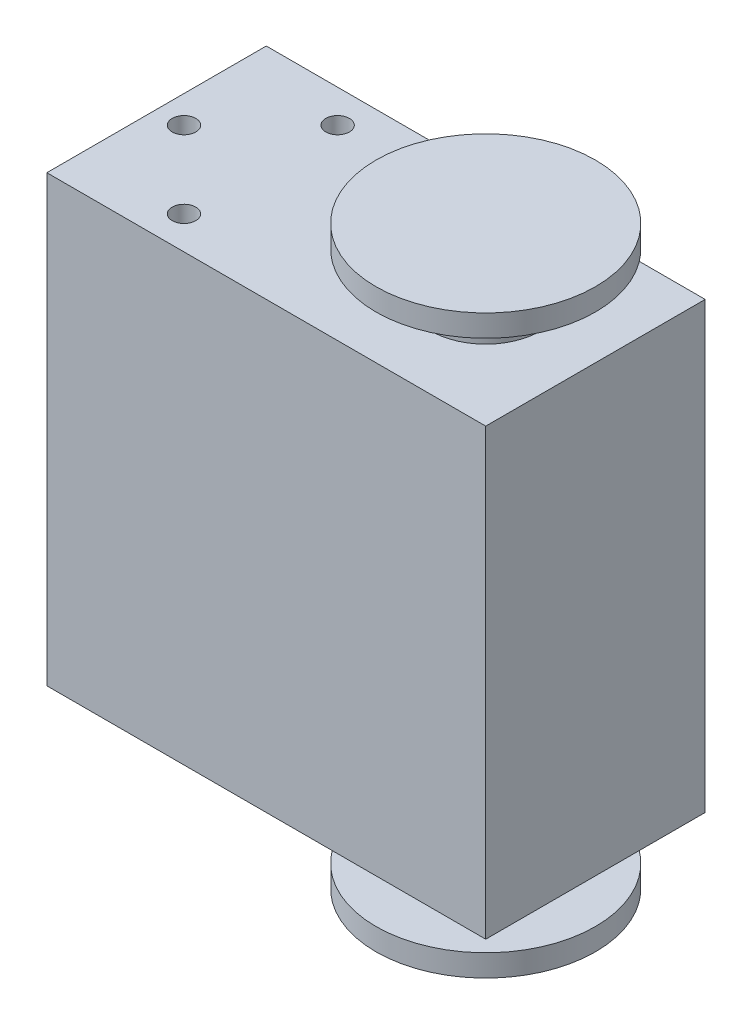
ISO-10303-21;
HEADER;
FILE_DESCRIPTION(('STEP AP214'),'2;1');
FILE_NAME('part.step','',(''),(''),'','','');
FILE_SCHEMA(('AUTOMOTIVE_DESIGN { 1 0 10303 214 1 1 1 1 }'));
ENDSEC;
DATA;
#1=APPLICATION_CONTEXT('core data for automotive mechanical design processes');
#2=APPLICATION_PROTOCOL_DEFINITION('international standard','automotive_design',2000,#1);
#3=PRODUCT_CONTEXT('',#1,'mechanical');
#4=PRODUCT('Part','Part','',(#3));
#5=PRODUCT_RELATED_PRODUCT_CATEGORY('part','',(#4));
#6=PRODUCT_DEFINITION_FORMATION('','',#4);
#7=PRODUCT_DEFINITION_CONTEXT('part definition',#1,'design');
#8=PRODUCT_DEFINITION('design','',#6,#7);
#9=PRODUCT_DEFINITION_SHAPE('','',#8);
#10=(LENGTH_UNIT() NAMED_UNIT(*) SI_UNIT(.MILLI.,.METRE.));
#11=(NAMED_UNIT(*) PLANE_ANGLE_UNIT() SI_UNIT($,.RADIAN.));
#12=(NAMED_UNIT(*) SI_UNIT($,.STERADIAN.) SOLID_ANGLE_UNIT());
#13=UNCERTAINTY_MEASURE_WITH_UNIT(LENGTH_MEASURE(1.E-05),#10,'distance_accuracy_value','');
#14=(GEOMETRIC_REPRESENTATION_CONTEXT(3) GLOBAL_UNCERTAINTY_ASSIGNED_CONTEXT((#13)) GLOBAL_UNIT_ASSIGNED_CONTEXT((#10,
#11,#12)) REPRESENTATION_CONTEXT('',''));
#15=CARTESIAN_POINT('',(0.,0.,0.));
#16=DIRECTION('',(0.,0.,1.));
#17=DIRECTION('',(1.,0.,0.));
#18=AXIS2_PLACEMENT_3D('',#15,#16,#17);
#19=CARTESIAN_POINT('',(0.,0.,-20.));
#20=DIRECTION('',(1.,0.,0.));
#21=DIRECTION('',(0.,0.,1.));
#22=AXIS2_PLACEMENT_3D('',#19,#20,#21);
#23=PLANE('',#22);
#24=DIRECTION('',(0.,-1.,0.));
#25=VECTOR('',#24,1.);
#26=CARTESIAN_POINT('',(0.,0.,0.));
#27=LINE('',#26,#25);
#28=CARTESIAN_POINT('',(0.,40.5,0.));
#29=VERTEX_POINT('',#28);
#30=CARTESIAN_POINT('',(0.,0.,0.));
#31=VERTEX_POINT('',#30);
#32=EDGE_CURVE('E100',#29,#31,#27,.T.);
#33=ORIENTED_EDGE('',*,*,#32,.F.);
#34=DIRECTION('',(0.,0.,1.));
#35=VECTOR('',#34,1.);
#36=CARTESIAN_POINT('',(0.,40.5,-20.));
#37=LINE('',#36,#35);
#38=CARTESIAN_POINT('',(0.,40.5,-20.));
#39=VERTEX_POINT('',#38);
#40=EDGE_CURVE('E99',#39,#29,#37,.T.);
#41=ORIENTED_EDGE('',*,*,#40,.F.);
#42=DIRECTION('',(0.,-1.,0.));
#43=VECTOR('',#42,1.);
#44=CARTESIAN_POINT('',(0.,0.,-20.));
#45=LINE('',#44,#43);
#46=CARTESIAN_POINT('',(0.,0.,-20.));
#47=VERTEX_POINT('',#46);
#48=EDGE_CURVE('E93',#39,#47,#45,.T.);
#49=ORIENTED_EDGE('',*,*,#48,.T.);
#50=DIRECTION('',(0.,0.,1.));
#51=VECTOR('',#50,1.);
#52=CARTESIAN_POINT('',(0.,0.,-20.));
#53=LINE('',#52,#51);
#54=EDGE_CURVE('E11',#47,#31,#53,.T.);
#55=ORIENTED_EDGE('',*,*,#54,.T.);
#56=EDGE_LOOP('',(#33,#41,#49,#55));
#57=FACE_BOUND('',#56,.T.);
#58=ADVANCED_FACE('F35',(#57),#23,.F.);
#59=CARTESIAN_POINT('',(0.,0.,-20.));
#60=DIRECTION('',(0.,1.,0.));
#61=DIRECTION('',(0.,0.,-1.));
#62=AXIS2_PLACEMENT_3D('',#59,#60,#61);
#63=PLANE('',#62);
#64=CARTESIAN_POINT('',(2.5,0.,-2.5));
#65=DIRECTION('',(0.,1.,0.));
#66=DIRECTION('',(0.,0.,1.));
#67=AXIS2_PLACEMENT_3D('',#64,#65,#66);
#68=CIRCLE('',#67,1.);
#69=CARTESIAN_POINT('',(2.5,0.,-1.5));
#70=VERTEX_POINT('',#69);
#71=EDGE_CURVE('E147',#70,#70,#68,.T.);
#72=ORIENTED_EDGE('',*,*,#71,.T.);
#73=EDGE_LOOP('',(#72));
#74=FACE_BOUND('',#73,.T.);
#75=CARTESIAN_POINT('',(2.5,0.,-17.5));
#76=DIRECTION('',(0.,1.,0.));
#77=DIRECTION('',(0.,0.,1.));
#78=AXIS2_PLACEMENT_3D('',#75,#76,#77);
#79=CIRCLE('',#78,1.);
#80=CARTESIAN_POINT('',(2.5,0.,-16.5));
#81=VERTEX_POINT('',#80);
#82=EDGE_CURVE('E153',#81,#81,#79,.T.);
#83=ORIENTED_EDGE('',*,*,#82,.T.);
#84=EDGE_LOOP('',(#83));
#85=FACE_BOUND('',#84,.T.);
#86=CARTESIAN_POINT('',(17.5,0.,-17.5));
#87=DIRECTION('',(0.,1.,0.));
#88=DIRECTION('',(0.,0.,1.));
#89=AXIS2_PLACEMENT_3D('',#86,#87,#88);
#90=CIRCLE('',#89,1.);
#91=CARTESIAN_POINT('',(17.5,0.,-16.5));
#92=VERTEX_POINT('',#91);
#93=EDGE_CURVE('E159',#92,#92,#90,.T.);
#94=ORIENTED_EDGE('',*,*,#93,.T.);
#95=EDGE_LOOP('',(#94));
#96=FACE_BOUND('',#95,.T.);
#97=CARTESIAN_POINT('',(17.5,0.,-2.5));
#98=DIRECTION('',(0.,1.,0.));
#99=DIRECTION('',(0.,0.,1.));
#100=AXIS2_PLACEMENT_3D('',#97,#98,#99);
#101=CIRCLE('',#100,1.);
#102=CARTESIAN_POINT('',(17.5,0.,-1.5));
#103=VERTEX_POINT('',#102);
#104=EDGE_CURVE('E165',#103,#103,#101,.T.);
#105=ORIENTED_EDGE('',*,*,#104,.T.);
#106=EDGE_LOOP('',(#105));
#107=FACE_BOUND('',#106,.T.);
#108=DIRECTION('',(1.,0.,0.));
#109=VECTOR('',#108,1.);
#110=CARTESIAN_POINT('',(0.,0.,0.));
#111=LINE('',#110,#109);
#112=CARTESIAN_POINT('',(40.,0.,0.));
#113=VERTEX_POINT('',#112);
#114=EDGE_CURVE('E102',#31,#113,#111,.T.);
#115=ORIENTED_EDGE('',*,*,#114,.F.);
#116=ORIENTED_EDGE('',*,*,#54,.F.);
#117=DIRECTION('',(1.,0.,0.));
#118=VECTOR('',#117,1.);
#119=CARTESIAN_POINT('',(0.,0.,-20.));
#120=LINE('',#119,#118);
#121=CARTESIAN_POINT('',(40.,0.,-20.));
#122=VERTEX_POINT('',#121);
#123=EDGE_CURVE('E75',#47,#122,#120,.T.);
#124=ORIENTED_EDGE('',*,*,#123,.T.);
#125=DIRECTION('',(0.,0.,1.));
#126=VECTOR('',#125,1.);
#127=CARTESIAN_POINT('',(40.,0.,-20.));
#128=LINE('',#127,#126);
#129=EDGE_CURVE('E43',#122,#113,#128,.T.);
#130=ORIENTED_EDGE('',*,*,#129,.T.);
#131=EDGE_LOOP('',(#115,#116,#124,#130));
#132=FACE_BOUND('',#131,.T.);
#133=CARTESIAN_POINT('',(30.,0.,-10.));
#134=DIRECTION('',(0.,-1.,0.));
#135=DIRECTION('',(0.,0.,-1.));
#136=AXIS2_PLACEMENT_3D('',#133,#134,#135);
#137=CIRCLE('',#136,5.);
#138=CARTESIAN_POINT('',(30.,0.,-15.));
#139=VERTEX_POINT('',#138);
#140=EDGE_CURVE('E437',#139,#139,#137,.T.);
#141=ORIENTED_EDGE('',*,*,#140,.F.);
#142=EDGE_LOOP('',(#141));
#143=FACE_BOUND('',#142,.T.);
#144=ADVANCED_FACE('F90',(#74,#85,#96,#107,#132,#143),#63,.F.);
#145=CARTESIAN_POINT('',(40.,0.,-20.));
#146=DIRECTION('',(-1.,0.,0.));
#147=DIRECTION('',(0.,0.,-1.));
#148=AXIS2_PLACEMENT_3D('',#145,#146,#147);
#149=PLANE('',#148);
#150=ORIENTED_EDGE('',*,*,#129,.F.);
#151=DIRECTION('',(0.,1.,0.));
#152=VECTOR('',#151,1.);
#153=CARTESIAN_POINT('',(40.,0.,-20.));
#154=LINE('',#153,#152);
#155=CARTESIAN_POINT('',(40.,40.5,-20.));
#156=VERTEX_POINT('',#155);
#157=EDGE_CURVE('E78',#122,#156,#154,.T.);
#158=ORIENTED_EDGE('',*,*,#157,.T.);
#159=DIRECTION('',(0.,0.,1.));
#160=VECTOR('',#159,1.);
#161=CARTESIAN_POINT('',(40.,40.5,-20.));
#162=LINE('',#161,#160);
#163=CARTESIAN_POINT('',(40.,40.5,0.));
#164=VERTEX_POINT('',#163);
#165=EDGE_CURVE('E89',#156,#164,#162,.T.);
#166=ORIENTED_EDGE('',*,*,#165,.T.);
#167=DIRECTION('',(0.,1.,0.));
#168=VECTOR('',#167,1.);
#169=CARTESIAN_POINT('',(40.,0.,0.));
#170=LINE('',#169,#168);
#171=EDGE_CURVE('E86',#113,#164,#170,.T.);
#172=ORIENTED_EDGE('',*,*,#171,.F.);
#173=EDGE_LOOP('',(#150,#158,#166,#172));
#174=FACE_BOUND('',#173,.T.);
#175=ADVANCED_FACE('F85',(#174),#149,.F.);
#176=CARTESIAN_POINT('',(0.,40.5,-20.));
#177=DIRECTION('',(0.,-1.,0.));
#178=DIRECTION('',(0.,0.,1.));
#179=AXIS2_PLACEMENT_3D('',#176,#177,#178);
#180=PLANE('',#179);
#181=CARTESIAN_POINT('',(9.5,40.5,-3.));
#182=DIRECTION('',(0.,-1.,0.));
#183=DIRECTION('',(0.,0.,-1.));
#184=AXIS2_PLACEMENT_3D('',#181,#182,#183);
#185=CIRCLE('',#184,1.07617120434425);
#186=CARTESIAN_POINT('',(9.5,40.5,-4.07617120434425));
#187=VERTEX_POINT('',#186);
#188=EDGE_CURVE('E131',#187,#187,#185,.T.);
#189=ORIENTED_EDGE('',*,*,#188,.T.);
#190=EDGE_LOOP('',(#189));
#191=FACE_BOUND('',#190,.T.);
#192=CARTESIAN_POINT('',(9.5,40.5,-17.));
#193=DIRECTION('',(0.,-1.,0.));
#194=DIRECTION('',(0.,0.,-1.));
#195=AXIS2_PLACEMENT_3D('',#192,#193,#194);
#196=CIRCLE('',#195,1.07617120434425);
#197=CARTESIAN_POINT('',(9.5,40.5,-18.0761712043443));
#198=VERTEX_POINT('',#197);
#199=EDGE_CURVE('E135',#198,#198,#196,.T.);
#200=ORIENTED_EDGE('',*,*,#199,.T.);
#201=EDGE_LOOP('',(#200));
#202=FACE_BOUND('',#201,.T.);
#203=CARTESIAN_POINT('',(2.5,40.5,-10.));
#204=DIRECTION('',(0.,-1.,0.));
#205=DIRECTION('',(0.,0.,-1.));
#206=AXIS2_PLACEMENT_3D('',#203,#204,#205);
#207=CIRCLE('',#206,1.07617120434425);
#208=CARTESIAN_POINT('',(2.5,40.5,-11.0761712043443));
#209=VERTEX_POINT('',#208);
#210=EDGE_CURVE('E141',#209,#209,#207,.T.);
#211=ORIENTED_EDGE('',*,*,#210,.T.);
#212=EDGE_LOOP('',(#211));
#213=FACE_BOUND('',#212,.T.);
#214=ORIENTED_EDGE('',*,*,#40,.T.);
#215=DIRECTION('',(-1.,0.,0.));
#216=VECTOR('',#215,1.);
#217=CARTESIAN_POINT('',(0.,40.5,0.));
#218=LINE('',#217,#216);
#219=EDGE_CURVE('E65',#164,#29,#218,.T.);
#220=ORIENTED_EDGE('',*,*,#219,.F.);
#221=ORIENTED_EDGE('',*,*,#165,.F.);
#222=DIRECTION('',(-1.,0.,0.));
#223=VECTOR('',#222,1.);
#224=CARTESIAN_POINT('',(0.,40.5,-20.));
#225=LINE('',#224,#223);
#226=EDGE_CURVE('E51',#156,#39,#225,.T.);
#227=ORIENTED_EDGE('',*,*,#226,.T.);
#228=EDGE_LOOP('',(#214,#220,#221,#227));
#229=FACE_BOUND('',#228,.T.);
#230=CARTESIAN_POINT('',(30.,40.5,-10.));
#231=DIRECTION('',(0.,-1.,0.));
#232=DIRECTION('',(0.,0.,-1.));
#233=AXIS2_PLACEMENT_3D('',#230,#231,#232);
#234=CIRCLE('',#233,5.);
#235=CARTESIAN_POINT('',(30.,40.5,-15.));
#236=VERTEX_POINT('',#235);
#237=EDGE_CURVE('E117',#236,#236,#234,.T.);
#238=ORIENTED_EDGE('',*,*,#237,.T.);
#239=EDGE_LOOP('',(#238));
#240=FACE_BOUND('',#239,.T.);
#241=ADVANCED_FACE('F108',(#191,#202,#213,#229,#240),#180,.F.);
#242=CARTESIAN_POINT('',(0.,0.,-20.));
#243=DIRECTION('',(0.,0.,1.));
#244=DIRECTION('',(-1.,0.,0.));
#245=AXIS2_PLACEMENT_3D('',#242,#243,#244);
#246=PLANE('',#245);
#247=ORIENTED_EDGE('',*,*,#123,.F.);
#248=ORIENTED_EDGE('',*,*,#48,.F.);
#249=ORIENTED_EDGE('',*,*,#226,.F.);
#250=ORIENTED_EDGE('',*,*,#157,.F.);
#251=EDGE_LOOP('',(#247,#248,#249,#250));
#252=FACE_BOUND('',#251,.T.);
#253=ADVANCED_FACE('F80',(#252),#246,.F.);
#254=CARTESIAN_POINT('',(0.,0.,0.));
#255=DIRECTION('',(0.,0.,1.));
#256=DIRECTION('',(-1.,0.,0.));
#257=AXIS2_PLACEMENT_3D('',#254,#255,#256);
#258=PLANE('',#257);
#259=ORIENTED_EDGE('',*,*,#32,.T.);
#260=ORIENTED_EDGE('',*,*,#114,.T.);
#261=ORIENTED_EDGE('',*,*,#171,.T.);
#262=ORIENTED_EDGE('',*,*,#219,.T.);
#263=EDGE_LOOP('',(#259,#260,#261,#262));
#264=FACE_BOUND('',#263,.T.);
#265=ADVANCED_FACE('F201',(#264),#258,.T.);
#266=CARTESIAN_POINT('',(17.5,5.,-2.5));
#267=DIRECTION('',(0.,-1.,0.));
#268=DIRECTION('',(0.,0.,1.));
#269=AXIS2_PLACEMENT_3D('',#266,#267,#268);
#270=CYLINDRICAL_SURFACE('',#269,1.);
#271=CARTESIAN_POINT('',(17.5,5.,-2.5));
#272=DIRECTION('',(0.,1.,0.));
#273=DIRECTION('',(0.,0.,1.));
#274=AXIS2_PLACEMENT_3D('',#271,#272,#273);
#275=CIRCLE('',#274,1.);
#276=CARTESIAN_POINT('',(17.5,5.,-1.5));
#277=VERTEX_POINT('',#276);
#278=EDGE_CURVE('E168',#277,#277,#275,.T.);
#279=ORIENTED_EDGE('',*,*,#278,.T.);
#280=EDGE_LOOP('',(#279));
#281=FACE_BOUND('',#280,.T.);
#282=ORIENTED_EDGE('',*,*,#104,.F.);
#283=EDGE_LOOP('',(#282));
#284=FACE_BOUND('',#283,.T.);
#285=ADVANCED_FACE('F203',(#281,#284),#270,.F.);
#286=CARTESIAN_POINT('',(17.5,5.,-2.5));
#287=DIRECTION('',(0.,-1.,0.));
#288=DIRECTION('',(0.,0.,1.));
#289=AXIS2_PLACEMENT_3D('',#286,#287,#288);
#290=PLANE('',#289);
#291=ORIENTED_EDGE('',*,*,#278,.F.);
#292=EDGE_LOOP('',(#291));
#293=FACE_BOUND('',#292,.T.);
#294=ADVANCED_FACE('F209',(#293),#290,.T.);
#295=CARTESIAN_POINT('',(17.5,5.,-17.5));
#296=DIRECTION('',(0.,-1.,0.));
#297=DIRECTION('',(0.,0.,1.));
#298=AXIS2_PLACEMENT_3D('',#295,#296,#297);
#299=CYLINDRICAL_SURFACE('',#298,1.);
#300=CARTESIAN_POINT('',(17.5,5.,-17.5));
#301=DIRECTION('',(0.,1.,0.));
#302=DIRECTION('',(0.,0.,1.));
#303=AXIS2_PLACEMENT_3D('',#300,#301,#302);
#304=CIRCLE('',#303,1.);
#305=CARTESIAN_POINT('',(17.5,5.,-16.5));
#306=VERTEX_POINT('',#305);
#307=EDGE_CURVE('E162',#306,#306,#304,.T.);
#308=ORIENTED_EDGE('',*,*,#307,.T.);
#309=EDGE_LOOP('',(#308));
#310=FACE_BOUND('',#309,.T.);
#311=ORIENTED_EDGE('',*,*,#93,.F.);
#312=EDGE_LOOP('',(#311));
#313=FACE_BOUND('',#312,.T.);
#314=ADVANCED_FACE('F245',(#310,#313),#299,.F.);
#315=CARTESIAN_POINT('',(17.5,5.,-17.5));
#316=DIRECTION('',(0.,-1.,0.));
#317=DIRECTION('',(0.,0.,1.));
#318=AXIS2_PLACEMENT_3D('',#315,#316,#317);
#319=PLANE('',#318);
#320=ORIENTED_EDGE('',*,*,#307,.F.);
#321=EDGE_LOOP('',(#320));
#322=FACE_BOUND('',#321,.T.);
#323=ADVANCED_FACE('F255',(#322),#319,.T.);
#324=CARTESIAN_POINT('',(2.5,5.,-17.5));
#325=DIRECTION('',(0.,-1.,0.));
#326=DIRECTION('',(0.,0.,1.));
#327=AXIS2_PLACEMENT_3D('',#324,#325,#326);
#328=CYLINDRICAL_SURFACE('',#327,1.);
#329=CARTESIAN_POINT('',(2.5,5.,-17.5));
#330=DIRECTION('',(0.,1.,0.));
#331=DIRECTION('',(0.,0.,1.));
#332=AXIS2_PLACEMENT_3D('',#329,#330,#331);
#333=CIRCLE('',#332,1.);
#334=CARTESIAN_POINT('',(2.5,5.,-16.5));
#335=VERTEX_POINT('',#334);
#336=EDGE_CURVE('E156',#335,#335,#333,.T.);
#337=ORIENTED_EDGE('',*,*,#336,.T.);
#338=EDGE_LOOP('',(#337));
#339=FACE_BOUND('',#338,.T.);
#340=ORIENTED_EDGE('',*,*,#82,.F.);
#341=EDGE_LOOP('',(#340));
#342=FACE_BOUND('',#341,.T.);
#343=ADVANCED_FACE('F265',(#339,#342),#328,.F.);
#344=CARTESIAN_POINT('',(2.5,5.,-17.5));
#345=DIRECTION('',(0.,-1.,0.));
#346=DIRECTION('',(0.,0.,1.));
#347=AXIS2_PLACEMENT_3D('',#344,#345,#346);
#348=PLANE('',#347);
#349=ORIENTED_EDGE('',*,*,#336,.F.);
#350=EDGE_LOOP('',(#349));
#351=FACE_BOUND('',#350,.T.);
#352=ADVANCED_FACE('F275',(#351),#348,.T.);
#353=CARTESIAN_POINT('',(2.5,5.,-2.5));
#354=DIRECTION('',(0.,-1.,0.));
#355=DIRECTION('',(0.,0.,1.));
#356=AXIS2_PLACEMENT_3D('',#353,#354,#355);
#357=CYLINDRICAL_SURFACE('',#356,1.);
#358=CARTESIAN_POINT('',(2.5,5.,-2.5));
#359=DIRECTION('',(0.,1.,0.));
#360=DIRECTION('',(0.,0.,1.));
#361=AXIS2_PLACEMENT_3D('',#358,#359,#360);
#362=CIRCLE('',#361,1.);
#363=CARTESIAN_POINT('',(2.5,5.,-1.5));
#364=VERTEX_POINT('',#363);
#365=EDGE_CURVE('E150',#364,#364,#362,.T.);
#366=ORIENTED_EDGE('',*,*,#365,.T.);
#367=EDGE_LOOP('',(#366));
#368=FACE_BOUND('',#367,.T.);
#369=ORIENTED_EDGE('',*,*,#71,.F.);
#370=EDGE_LOOP('',(#369));
#371=FACE_BOUND('',#370,.T.);
#372=ADVANCED_FACE('F285',(#368,#371),#357,.F.);
#373=CARTESIAN_POINT('',(2.5,5.,-2.5));
#374=DIRECTION('',(0.,-1.,0.));
#375=DIRECTION('',(0.,0.,1.));
#376=AXIS2_PLACEMENT_3D('',#373,#374,#375);
#377=PLANE('',#376);
#378=ORIENTED_EDGE('',*,*,#365,.F.);
#379=EDGE_LOOP('',(#378));
#380=FACE_BOUND('',#379,.T.);
#381=ADVANCED_FACE('F295',(#380),#377,.T.);
#382=CARTESIAN_POINT('',(2.5,35.5,-10.));
#383=DIRECTION('',(0.,1.,0.));
#384=DIRECTION('',(0.,0.,-1.));
#385=AXIS2_PLACEMENT_3D('',#382,#383,#384);
#386=CYLINDRICAL_SURFACE('',#385,1.07617120434425);
#387=CARTESIAN_POINT('',(2.5,35.5,-10.));
#388=DIRECTION('',(0.,-1.,0.));
#389=DIRECTION('',(0.,0.,-1.));
#390=AXIS2_PLACEMENT_3D('',#387,#388,#389);
#391=CIRCLE('',#390,1.07617120434425);
#392=CARTESIAN_POINT('',(2.5,35.5,-11.0761712043443));
#393=VERTEX_POINT('',#392);
#394=EDGE_CURVE('E144',#393,#393,#391,.T.);
#395=ORIENTED_EDGE('',*,*,#394,.T.);
#396=EDGE_LOOP('',(#395));
#397=FACE_BOUND('',#396,.T.);
#398=ORIENTED_EDGE('',*,*,#210,.F.);
#399=EDGE_LOOP('',(#398));
#400=FACE_BOUND('',#399,.T.);
#401=ADVANCED_FACE('F305',(#397,#400),#386,.F.);
#402=CARTESIAN_POINT('',(2.5,35.5,-10.));
#403=DIRECTION('',(0.,1.,0.));
#404=DIRECTION('',(0.,0.,-1.));
#405=AXIS2_PLACEMENT_3D('',#402,#403,#404);
#406=PLANE('',#405);
#407=ORIENTED_EDGE('',*,*,#394,.F.);
#408=EDGE_LOOP('',(#407));
#409=FACE_BOUND('',#408,.T.);
#410=ADVANCED_FACE('F315',(#409),#406,.T.);
#411=CARTESIAN_POINT('',(9.5,35.5,-17.));
#412=DIRECTION('',(0.,1.,0.));
#413=DIRECTION('',(0.,0.,-1.));
#414=AXIS2_PLACEMENT_3D('',#411,#412,#413);
#415=CYLINDRICAL_SURFACE('',#414,1.07617120434425);
#416=CARTESIAN_POINT('',(9.5,35.5,-17.));
#417=DIRECTION('',(0.,-1.,0.));
#418=DIRECTION('',(0.,0.,-1.));
#419=AXIS2_PLACEMENT_3D('',#416,#417,#418);
#420=CIRCLE('',#419,1.07617120434425);
#421=CARTESIAN_POINT('',(9.5,35.5,-18.0761712043443));
#422=VERTEX_POINT('',#421);
#423=EDGE_CURVE('E138',#422,#422,#420,.T.);
#424=ORIENTED_EDGE('',*,*,#423,.T.);
#425=EDGE_LOOP('',(#424));
#426=FACE_BOUND('',#425,.T.);
#427=ORIENTED_EDGE('',*,*,#199,.F.);
#428=EDGE_LOOP('',(#427));
#429=FACE_BOUND('',#428,.T.);
#430=ADVANCED_FACE('F325',(#426,#429),#415,.F.);
#431=CARTESIAN_POINT('',(9.5,35.5,-17.));
#432=DIRECTION('',(0.,1.,0.));
#433=DIRECTION('',(0.,0.,-1.));
#434=AXIS2_PLACEMENT_3D('',#431,#432,#433);
#435=PLANE('',#434);
#436=ORIENTED_EDGE('',*,*,#423,.F.);
#437=EDGE_LOOP('',(#436));
#438=FACE_BOUND('',#437,.T.);
#439=ADVANCED_FACE('F335',(#438),#435,.T.);
#440=CARTESIAN_POINT('',(9.5,35.5,-3.));
#441=DIRECTION('',(0.,1.,0.));
#442=DIRECTION('',(0.,0.,-1.));
#443=AXIS2_PLACEMENT_3D('',#440,#441,#442);
#444=CYLINDRICAL_SURFACE('',#443,1.07617120434425);
#445=CARTESIAN_POINT('',(9.5,35.5,-3.));
#446=DIRECTION('',(0.,-1.,0.));
#447=DIRECTION('',(0.,0.,-1.));
#448=AXIS2_PLACEMENT_3D('',#445,#446,#447);
#449=CIRCLE('',#448,1.07617120434425);
#450=CARTESIAN_POINT('',(9.5,35.5,-4.07617120434425));
#451=VERTEX_POINT('',#450);
#452=EDGE_CURVE('E132',#451,#451,#449,.T.);
#453=ORIENTED_EDGE('',*,*,#452,.T.);
#454=EDGE_LOOP('',(#453));
#455=FACE_BOUND('',#454,.T.);
#456=ORIENTED_EDGE('',*,*,#188,.F.);
#457=EDGE_LOOP('',(#456));
#458=FACE_BOUND('',#457,.T.);
#459=ADVANCED_FACE('F345',(#455,#458),#444,.F.);
#460=CARTESIAN_POINT('',(9.5,35.5,-3.));
#461=DIRECTION('',(0.,1.,0.));
#462=DIRECTION('',(0.,0.,-1.));
#463=AXIS2_PLACEMENT_3D('',#460,#461,#462);
#464=PLANE('',#463);
#465=ORIENTED_EDGE('',*,*,#452,.F.);
#466=EDGE_LOOP('',(#465));
#467=FACE_BOUND('',#466,.T.);
#468=ADVANCED_FACE('F355',(#467),#464,.T.);
#469=CARTESIAN_POINT('',(30.,44.5,-10.));
#470=DIRECTION('',(0.,1.,0.));
#471=DIRECTION('',(0.,0.,-1.));
#472=AXIS2_PLACEMENT_3D('',#469,#470,#471);
#473=PLANE('',#472);
#474=CARTESIAN_POINT('',(30.,44.5,-10.));
#475=DIRECTION('',(0.,-1.,0.));
#476=DIRECTION('',(0.,0.,-1.));
#477=AXIS2_PLACEMENT_3D('',#474,#475,#476);
#478=CIRCLE('',#477,10.);
#479=CARTESIAN_POINT('',(30.,44.5,-20.));
#480=VERTEX_POINT('',#479);
#481=EDGE_CURVE('E123',#480,#480,#478,.T.);
#482=ORIENTED_EDGE('',*,*,#481,.T.);
#483=EDGE_LOOP('',(#482));
#484=FACE_BOUND('',#483,.T.);
#485=CARTESIAN_POINT('',(30.,44.5,-10.));
#486=DIRECTION('',(0.,-1.,0.));
#487=DIRECTION('',(0.,0.,-1.));
#488=AXIS2_PLACEMENT_3D('',#485,#486,#487);
#489=CIRCLE('',#488,5.);
#490=CARTESIAN_POINT('',(30.,44.5,-15.));
#491=VERTEX_POINT('',#490);
#492=EDGE_CURVE('E119',#491,#491,#489,.T.);
#493=ORIENTED_EDGE('',*,*,#492,.F.);
#494=EDGE_LOOP('',(#493));
#495=FACE_BOUND('',#494,.T.);
#496=ADVANCED_FACE('F365',(#484,#495),#473,.F.);
#497=CARTESIAN_POINT('',(30.,44.5,-10.));
#498=DIRECTION('',(0.,-1.,0.));
#499=DIRECTION('',(0.,0.,1.));
#500=AXIS2_PLACEMENT_3D('',#497,#498,#499);
#501=CYLINDRICAL_SURFACE('',#500,5.);
#502=ORIENTED_EDGE('',*,*,#492,.T.);
#503=EDGE_LOOP('',(#502));
#504=FACE_BOUND('',#503,.T.);
#505=ORIENTED_EDGE('',*,*,#237,.F.);
#506=EDGE_LOOP('',(#505));
#507=FACE_BOUND('',#506,.T.);
#508=ADVANCED_FACE('F375',(#504,#507),#501,.T.);
#509=CARTESIAN_POINT('',(30.,46.5,-10.));
#510=DIRECTION('',(0.,1.,0.));
#511=DIRECTION('',(0.,0.,-1.));
#512=AXIS2_PLACEMENT_3D('',#509,#510,#511);
#513=PLANE('',#512);
#514=CARTESIAN_POINT('',(30.,46.5,-10.));
#515=DIRECTION('',(0.,-1.,0.));
#516=DIRECTION('',(0.,0.,-1.));
#517=AXIS2_PLACEMENT_3D('',#514,#515,#516);
#518=CIRCLE('',#517,10.);
#519=CARTESIAN_POINT('',(30.,46.5,-20.));
#520=VERTEX_POINT('',#519);
#521=EDGE_CURVE('E171',#520,#520,#518,.T.);
#522=ORIENTED_EDGE('',*,*,#521,.F.);
#523=EDGE_LOOP('',(#522));
#524=FACE_BOUND('',#523,.T.);
#525=ADVANCED_FACE('F193',(#524),#513,.T.);
#526=CARTESIAN_POINT('',(30.,-6.,-10.));
#527=DIRECTION('',(0.,1.,0.));
#528=DIRECTION('',(0.,0.,-1.));
#529=AXIS2_PLACEMENT_3D('',#526,#527,#528);
#530=CYLINDRICAL_SURFACE('',#529,10.);
#531=CARTESIAN_POINT('',(30.,44.5,-20.));
#532=CARTESIAN_POINT('',(30.,44.5208333333333,-20.));
#533=CARTESIAN_POINT('',(30.,44.5416666666667,-20.));
#534=CARTESIAN_POINT('',(30.,44.5833333333333,-20.));
#535=CARTESIAN_POINT('',(30.,44.6041666666667,-20.));
#536=CARTESIAN_POINT('',(30.,44.6458333333333,-20.));
#537=CARTESIAN_POINT('',(30.,44.6666666666667,-20.));
#538=CARTESIAN_POINT('',(30.,44.7083333333333,-20.));
#539=CARTESIAN_POINT('',(30.,44.7291666666667,-20.));
#540=CARTESIAN_POINT('',(30.,44.7708333333333,-20.));
#541=CARTESIAN_POINT('',(30.,44.7916666666667,-20.));
#542=CARTESIAN_POINT('',(30.,44.8333333333333,-20.));
#543=CARTESIAN_POINT('',(30.,44.8541666666667,-20.));
#544=CARTESIAN_POINT('',(30.,44.8958333333333,-20.));
#545=CARTESIAN_POINT('',(30.,44.9166666666667,-20.));
#546=CARTESIAN_POINT('',(30.,44.9583333333333,-20.));
#547=CARTESIAN_POINT('',(30.,44.9791666666667,-20.));
#548=CARTESIAN_POINT('',(30.,45.0208333333333,-20.));
#549=CARTESIAN_POINT('',(30.,45.0416666666667,-20.));
#550=CARTESIAN_POINT('',(30.,45.0833333333333,-20.));
#551=CARTESIAN_POINT('',(30.,45.1041666666667,-20.));
#552=CARTESIAN_POINT('',(30.,45.1458333333333,-20.));
#553=CARTESIAN_POINT('',(30.,45.1666666666667,-20.));
#554=CARTESIAN_POINT('',(30.,45.2083333333333,-20.));
#555=CARTESIAN_POINT('',(30.,45.2291666666667,-20.));
#556=CARTESIAN_POINT('',(30.,45.2708333333333,-20.));
#557=CARTESIAN_POINT('',(30.,45.2916666666667,-20.));
#558=CARTESIAN_POINT('',(30.,45.3333333333333,-20.));
#559=CARTESIAN_POINT('',(30.,45.3541666666667,-20.));
#560=CARTESIAN_POINT('',(30.,45.3958333333333,-20.));
#561=CARTESIAN_POINT('',(30.,45.4166666666667,-20.));
#562=CARTESIAN_POINT('',(30.,45.4583333333333,-20.));
#563=CARTESIAN_POINT('',(30.,45.4791666666667,-20.));
#564=CARTESIAN_POINT('',(30.,45.5208333333333,-20.));
#565=CARTESIAN_POINT('',(30.,45.5416666666667,-20.));
#566=CARTESIAN_POINT('',(30.,45.5833333333333,-20.));
#567=CARTESIAN_POINT('',(30.,45.6041666666667,-20.));
#568=CARTESIAN_POINT('',(30.,45.6458333333333,-20.));
#569=CARTESIAN_POINT('',(30.,45.6666666666667,-20.));
#570=CARTESIAN_POINT('',(30.,45.7083333333333,-20.));
#571=CARTESIAN_POINT('',(30.,45.7291666666667,-20.));
#572=CARTESIAN_POINT('',(30.,45.7708333333333,-20.));
#573=CARTESIAN_POINT('',(30.,45.7916666666667,-20.));
#574=CARTESIAN_POINT('',(30.,45.8333333333333,-20.));
#575=CARTESIAN_POINT('',(30.,45.8541666666667,-20.));
#576=CARTESIAN_POINT('',(30.,45.8958333333333,-20.));
#577=CARTESIAN_POINT('',(30.,45.9166666666667,-20.));
#578=CARTESIAN_POINT('',(30.,45.9583333333333,-20.));
#579=CARTESIAN_POINT('',(30.,45.9791666666667,-20.));
#580=CARTESIAN_POINT('',(30.,46.0208333333333,-20.));
#581=CARTESIAN_POINT('',(30.,46.0416666666667,-20.));
#582=CARTESIAN_POINT('',(30.,46.0833333333333,-20.));
#583=CARTESIAN_POINT('',(30.,46.1041666666667,-20.));
#584=CARTESIAN_POINT('',(30.,46.1458333333333,-20.));
#585=CARTESIAN_POINT('',(30.,46.1666666666667,-20.));
#586=CARTESIAN_POINT('',(30.,46.2083333333333,-20.));
#587=CARTESIAN_POINT('',(30.,46.2291666666667,-20.));
#588=CARTESIAN_POINT('',(30.,46.2708333333333,-20.));
#589=CARTESIAN_POINT('',(30.,46.2916666666667,-20.));
#590=CARTESIAN_POINT('',(30.,46.3333333333333,-20.));
#591=CARTESIAN_POINT('',(30.,46.3541666666667,-20.));
#592=CARTESIAN_POINT('',(30.,46.3958333333333,-20.));
#593=CARTESIAN_POINT('',(30.,46.4166666666667,-20.));
#594=CARTESIAN_POINT('',(30.,46.4583333333333,-20.));
#595=CARTESIAN_POINT('',(30.,46.4791666666667,-20.));
#596=CARTESIAN_POINT('',(30.,46.5,-20.));
#597=B_SPLINE_CURVE_WITH_KNOTS('',3,(#531,#532,#533,#534,#535,#536,#537,#538,#539,#540,#541,
#542,#543,#544,#545,#546,#547,#548,#549,#550,#551,#552,#553,#554,#555,#556,#557,#558,#559,#560,
#561,#562,#563,#564,#565,#566,#567,#568,#569,#570,#571,#572,#573,#574,#575,#576,#577,#578,#579,
#580,#581,#582,#583,#584,#585,#586,#587,#588,#589,#590,#591,#592,#593,#594,#595,#596),
.UNSPECIFIED.,.F.,.F.,(4,2,2,2,2,2,2,2,2,2,2,2,2,2,2,2,2,2,2,2,2,2,2,2,2,2,2,2,2,2,2,2,4),(0.,
0.0625000000000001,0.125,0.1875,0.25,0.3125,0.375,0.4375,0.5,0.5625,0.625000000000001,
0.687500000000001,0.750000000000001,0.812500000000001,0.875000000000001,0.937500000000001,1.,
1.0625,1.125,1.1875,1.25,1.3125,1.375,1.4375,1.5,1.5625,1.625,1.6875,1.75,1.8125,1.875,1.9375,
2.),.UNSPECIFIED.);
#598=EDGE_CURVE('BSEAM184',#480,#520,#597,.T.);
#599=ORIENTED_EDGE('',*,*,#481,.F.);
#600=ORIENTED_EDGE('',*,*,#521,.T.);
#601=ORIENTED_EDGE('',*,*,#598,.T.);
#602=ORIENTED_EDGE('',*,*,#598,.F.);
#603=EDGE_LOOP('',(#599,#601,#600,#602));
#604=FACE_BOUND('',#603,.T.);
#605=ADVANCED_FACE('F184',(#604),#530,.T.);
#606=CARTESIAN_POINT('',(30.,-4.,-10.));
#607=DIRECTION('',(0.,-1.,0.));
#608=DIRECTION('',(0.,0.,-1.));
#609=AXIS2_PLACEMENT_3D('',#606,#607,#608);
#610=PLANE('',#609);
#611=CARTESIAN_POINT('',(30.,-4.,-10.));
#612=DIRECTION('',(0.,-1.,0.));
#613=DIRECTION('',(0.,0.,-1.));
#614=AXIS2_PLACEMENT_3D('',#611,#612,#613);
#615=CIRCLE('',#614,5.);
#616=CARTESIAN_POINT('',(30.,-4.,-15.));
#617=VERTEX_POINT('',#616);
#618=EDGE_CURVE('E126',#617,#617,#615,.T.);
#619=ORIENTED_EDGE('',*,*,#618,.T.);
#620=EDGE_LOOP('',(#619));
#621=FACE_BOUND('',#620,.T.);
#622=CARTESIAN_POINT('',(30.,-4.,-10.));
#623=DIRECTION('',(0.,-1.,0.));
#624=DIRECTION('',(0.,0.,-1.));
#625=AXIS2_PLACEMENT_3D('',#622,#623,#624);
#626=CIRCLE('',#625,10.);
#627=CARTESIAN_POINT('',(30.,-4.,-20.));
#628=VERTEX_POINT('',#627);
#629=EDGE_CURVE('E120',#628,#628,#626,.T.);
#630=ORIENTED_EDGE('',*,*,#629,.F.);
#631=EDGE_LOOP('',(#630));
#632=FACE_BOUND('',#631,.T.);
#633=ADVANCED_FACE('F192',(#621,#632),#610,.F.);
#634=CARTESIAN_POINT('',(30.,-4.,-10.));
#635=DIRECTION('',(0.,1.,0.));
#636=DIRECTION('',(0.,0.,-1.));
#637=AXIS2_PLACEMENT_3D('',#634,#635,#636);
#638=CYLINDRICAL_SURFACE('',#637,5.);
#639=ORIENTED_EDGE('',*,*,#618,.F.);
#640=EDGE_LOOP('',(#639));
#641=FACE_BOUND('',#640,.T.);
#642=ORIENTED_EDGE('',*,*,#140,.T.);
#643=EDGE_LOOP('',(#642));
#644=FACE_BOUND('',#643,.T.);
#645=ADVANCED_FACE('F188',(#641,#644),#638,.T.);
#646=CARTESIAN_POINT('',(30.,-6.,-10.));
#647=DIRECTION('',(0.,1.,0.));
#648=DIRECTION('',(0.,0.,-1.));
#649=AXIS2_PLACEMENT_3D('',#646,#647,#648);
#650=PLANE('',#649);
#651=CARTESIAN_POINT('',(30.,-6.,-10.));
#652=DIRECTION('',(0.,-1.,0.));
#653=DIRECTION('',(0.,0.,-1.));
#654=AXIS2_PLACEMENT_3D('',#651,#652,#653);
#655=CIRCLE('',#654,10.);
#656=CARTESIAN_POINT('',(30.,-6.,-20.));
#657=VERTEX_POINT('',#656);
#658=EDGE_CURVE('E103',#657,#657,#655,.T.);
#659=ORIENTED_EDGE('',*,*,#658,.T.);
#660=EDGE_LOOP('',(#659));
#661=FACE_BOUND('',#660,.T.);
#662=ADVANCED_FACE('F178',(#661),#650,.F.);
#663=CARTESIAN_POINT('',(30.,-4.,-20.));
#664=CARTESIAN_POINT('',(30.,-4.02083333333333,-20.));
#665=CARTESIAN_POINT('',(30.,-4.04166666666667,-20.));
#666=CARTESIAN_POINT('',(30.,-4.08333333333333,-20.));
#667=CARTESIAN_POINT('',(30.,-4.10416666666667,-20.));
#668=CARTESIAN_POINT('',(30.,-4.14583333333333,-20.));
#669=CARTESIAN_POINT('',(30.,-4.16666666666667,-20.));
#670=CARTESIAN_POINT('',(30.,-4.20833333333333,-20.));
#671=CARTESIAN_POINT('',(30.,-4.22916666666667,-20.));
#672=CARTESIAN_POINT('',(30.,-4.27083333333333,-20.));
#673=CARTESIAN_POINT('',(30.,-4.29166666666667,-20.));
#674=CARTESIAN_POINT('',(30.,-4.33333333333333,-20.));
#675=CARTESIAN_POINT('',(30.,-4.35416666666667,-20.));
#676=CARTESIAN_POINT('',(30.,-4.39583333333333,-20.));
#677=CARTESIAN_POINT('',(30.,-4.41666666666667,-20.));
#678=CARTESIAN_POINT('',(30.,-4.45833333333333,-20.));
#679=CARTESIAN_POINT('',(30.,-4.47916666666667,-20.));
#680=CARTESIAN_POINT('',(30.,-4.52083333333333,-20.));
#681=CARTESIAN_POINT('',(30.,-4.54166666666667,-20.));
#682=CARTESIAN_POINT('',(30.,-4.58333333333333,-20.));
#683=CARTESIAN_POINT('',(30.,-4.60416666666667,-20.));
#684=CARTESIAN_POINT('',(30.,-4.64583333333333,-20.));
#685=CARTESIAN_POINT('',(30.,-4.66666666666667,-20.));
#686=CARTESIAN_POINT('',(30.,-4.70833333333333,-20.));
#687=CARTESIAN_POINT('',(30.,-4.72916666666667,-20.));
#688=CARTESIAN_POINT('',(30.,-4.77083333333333,-20.));
#689=CARTESIAN_POINT('',(30.,-4.79166666666667,-20.));
#690=CARTESIAN_POINT('',(30.,-4.83333333333333,-20.));
#691=CARTESIAN_POINT('',(30.,-4.85416666666667,-20.));
#692=CARTESIAN_POINT('',(30.,-4.89583333333333,-20.));
#693=CARTESIAN_POINT('',(30.,-4.91666666666667,-20.));
#694=CARTESIAN_POINT('',(30.,-4.95833333333333,-20.));
#695=CARTESIAN_POINT('',(30.,-4.97916666666667,-20.));
#696=CARTESIAN_POINT('',(30.,-5.02083333333333,-20.));
#697=CARTESIAN_POINT('',(30.,-5.04166666666667,-20.));
#698=CARTESIAN_POINT('',(30.,-5.08333333333333,-20.));
#699=CARTESIAN_POINT('',(30.,-5.10416666666667,-20.));
#700=CARTESIAN_POINT('',(30.,-5.14583333333333,-20.));
#701=CARTESIAN_POINT('',(30.,-5.16666666666667,-20.));
#702=CARTESIAN_POINT('',(30.,-5.20833333333333,-20.));
#703=CARTESIAN_POINT('',(30.,-5.22916666666667,-20.));
#704=CARTESIAN_POINT('',(30.,-5.27083333333333,-20.));
#705=CARTESIAN_POINT('',(30.,-5.29166666666667,-20.));
#706=CARTESIAN_POINT('',(30.,-5.33333333333333,-20.));
#707=CARTESIAN_POINT('',(30.,-5.35416666666667,-20.));
#708=CARTESIAN_POINT('',(30.,-5.39583333333333,-20.));
#709=CARTESIAN_POINT('',(30.,-5.41666666666667,-20.));
#710=CARTESIAN_POINT('',(30.,-5.45833333333333,-20.));
#711=CARTESIAN_POINT('',(30.,-5.47916666666667,-20.));
#712=CARTESIAN_POINT('',(30.,-5.52083333333333,-20.));
#713=CARTESIAN_POINT('',(30.,-5.54166666666667,-20.));
#714=CARTESIAN_POINT('',(30.,-5.58333333333333,-20.));
#715=CARTESIAN_POINT('',(30.,-5.60416666666666,-20.));
#716=CARTESIAN_POINT('',(30.,-5.64583333333333,-20.));
#717=CARTESIAN_POINT('',(30.,-5.66666666666666,-20.));
#718=CARTESIAN_POINT('',(30.,-5.70833333333333,-20.));
#719=CARTESIAN_POINT('',(30.,-5.72916666666666,-20.));
#720=CARTESIAN_POINT('',(30.,-5.77083333333333,-20.));
#721=CARTESIAN_POINT('',(30.,-5.79166666666666,-20.));
#722=CARTESIAN_POINT('',(30.,-5.83333333333333,-20.));
#723=CARTESIAN_POINT('',(30.,-5.85416666666666,-20.));
#724=CARTESIAN_POINT('',(30.,-5.89583333333333,-20.));
#725=CARTESIAN_POINT('',(30.,-5.91666666666666,-20.));
#726=CARTESIAN_POINT('',(30.,-5.95833333333333,-20.));
#727=CARTESIAN_POINT('',(30.,-5.97916666666667,-20.));
#728=CARTESIAN_POINT('',(30.,-6.,-20.));
#729=B_SPLINE_CURVE_WITH_KNOTS('',3,(#663,#664,#665,#666,#667,#668,#669,#670,#671,#672,#673,
#674,#675,#676,#677,#678,#679,#680,#681,#682,#683,#684,#685,#686,#687,#688,#689,#690,#691,#692,
#693,#694,#695,#696,#697,#698,#699,#700,#701,#702,#703,#704,#705,#706,#707,#708,#709,#710,#711,
#712,#713,#714,#715,#716,#717,#718,#719,#720,#721,#722,#723,#724,#725,#726,#727,#728),
.UNSPECIFIED.,.F.,.F.,(4,2,2,2,2,2,2,2,2,2,2,2,2,2,2,2,2,2,2,2,2,2,2,2,2,2,2,2,2,2,2,2,4),(0.,
0.0624999999999992,0.124999999999999,0.187499999999999,0.249999999999999,0.312499999999999,
0.374999999999999,0.437499999999999,0.499999999999999,0.562499999999999,0.624999999999999,
0.687499999999999,0.749999999999999,0.812499999999999,0.874999999999999,0.937499999999999,
0.999999999999999,1.0625,1.125,1.1875,1.25,1.3125,1.375,1.4375,1.5,1.5625,1.625,1.6875,1.75,
1.8125,1.875,1.9375,2.),.UNSPECIFIED.);
#730=EDGE_CURVE('BSEAM180',#628,#657,#729,.T.);
#731=ORIENTED_EDGE('',*,*,#629,.T.);
#732=ORIENTED_EDGE('',*,*,#658,.F.);
#733=ORIENTED_EDGE('',*,*,#730,.T.);
#734=ORIENTED_EDGE('',*,*,#730,.F.);
#735=EDGE_LOOP('',(#731,#733,#732,#734));
#736=FACE_BOUND('',#735,.T.);
#737=ADVANCED_FACE('F180',(#736),#530,.T.);
#738=CLOSED_SHELL('',(#58,#144,#175,#241,#253,#265,#285,#294,#314,#323,#343,#352,#372,#381,#401,
#410,#430,#439,#459,#468,#496,#508,#525,#605,#633,#645,#662,#737));
#739=MANIFOLD_SOLID_BREP('B2',#738);
#740=ADVANCED_BREP_SHAPE_REPRESENTATION('',(#18,#739),#14);
#741=SHAPE_DEFINITION_REPRESENTATION(#9,#740);
ENDSEC;
END-ISO-10303-21;
